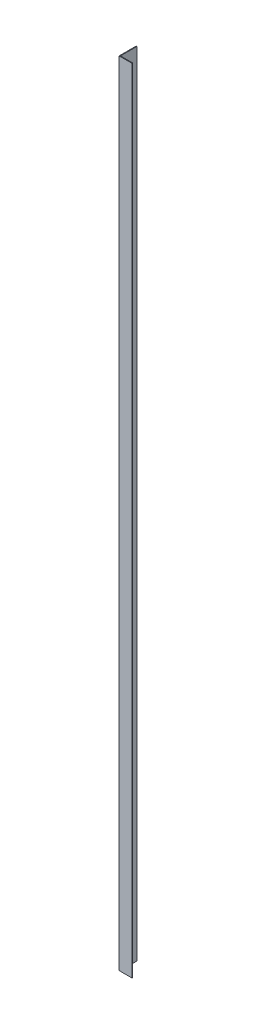
ISO-10303-21;
HEADER;
FILE_DESCRIPTION(('STEP AP214'),'2;1');
FILE_NAME('part.step','',(''),(''),'','','');
FILE_SCHEMA(('AUTOMOTIVE_DESIGN { 1 0 10303 214 1 1 1 1 }'));
ENDSEC;
DATA;
#1=APPLICATION_CONTEXT('core data for automotive mechanical design processes');
#2=APPLICATION_PROTOCOL_DEFINITION('international standard','automotive_design',2000,#1);
#3=PRODUCT_CONTEXT('',#1,'mechanical');
#4=PRODUCT('Part','Part','',(#3));
#5=PRODUCT_RELATED_PRODUCT_CATEGORY('part','',(#4));
#6=PRODUCT_DEFINITION_FORMATION('','',#4);
#7=PRODUCT_DEFINITION_CONTEXT('part definition',#1,'design');
#8=PRODUCT_DEFINITION('design','',#6,#7);
#9=PRODUCT_DEFINITION_SHAPE('','',#8);
#10=(LENGTH_UNIT() NAMED_UNIT(*) SI_UNIT(.MILLI.,.METRE.));
#11=(NAMED_UNIT(*) PLANE_ANGLE_UNIT() SI_UNIT($,.RADIAN.));
#12=(NAMED_UNIT(*) SI_UNIT($,.STERADIAN.) SOLID_ANGLE_UNIT());
#13=UNCERTAINTY_MEASURE_WITH_UNIT(LENGTH_MEASURE(1.E-05),#10,'distance_accuracy_value','');
#14=(GEOMETRIC_REPRESENTATION_CONTEXT(3) GLOBAL_UNCERTAINTY_ASSIGNED_CONTEXT((#13)) GLOBAL_UNIT_ASSIGNED_CONTEXT((#10,
#11,#12)) REPRESENTATION_CONTEXT('',''));
#15=CARTESIAN_POINT('',(0.,0.,0.));
#16=DIRECTION('',(0.,0.,1.));
#17=DIRECTION('',(1.,0.,0.));
#18=AXIS2_PLACEMENT_3D('',#15,#16,#17);
#19=CARTESIAN_POINT('',(670.,1970.,40.));
#20=DIRECTION('',(0.,0.,-1.));
#21=DIRECTION('',(-1.,0.,0.));
#22=AXIS2_PLACEMENT_3D('',#19,#20,#21);
#23=PLANE('',#22);
#24=DIRECTION('',(1.,0.,0.));
#25=VECTOR('',#24,1.);
#26=CARTESIAN_POINT('',(670.,120.,40.));
#27=LINE('',#26,#25);
#28=CARTESIAN_POINT('',(670.,120.,40.));
#29=VERTEX_POINT('',#28);
#30=CARTESIAN_POINT('',(700.,120.,40.));
#31=VERTEX_POINT('',#30);
#32=EDGE_CURVE('E123',#29,#31,#27,.T.);
#33=ORIENTED_EDGE('',*,*,#32,.T.);
#34=DIRECTION('',(0.,-1.,0.));
#35=VECTOR('',#34,1.);
#36=CARTESIAN_POINT('',(700.,1970.,40.));
#37=LINE('',#36,#35);
#38=CARTESIAN_POINT('',(700.,1970.,40.));
#39=VERTEX_POINT('',#38);
#40=EDGE_CURVE('E11',#39,#31,#37,.T.);
#41=ORIENTED_EDGE('',*,*,#40,.F.);
#42=DIRECTION('',(1.,0.,0.));
#43=VECTOR('',#42,1.);
#44=CARTESIAN_POINT('',(670.,1970.,40.));
#45=LINE('',#44,#43);
#46=CARTESIAN_POINT('',(670.,1970.,40.));
#47=VERTEX_POINT('',#46);
#48=EDGE_CURVE('E133',#47,#39,#45,.T.);
#49=ORIENTED_EDGE('',*,*,#48,.F.);
#50=DIRECTION('',(0.,-1.,0.));
#51=VECTOR('',#50,1.);
#52=CARTESIAN_POINT('',(670.,1970.,40.));
#53=LINE('',#52,#51);
#54=EDGE_CURVE('E119',#47,#29,#53,.T.);
#55=ORIENTED_EDGE('',*,*,#54,.T.);
#56=EDGE_LOOP('',(#33,#41,#49,#55));
#57=FACE_BOUND('',#56,.T.);
#58=ADVANCED_FACE('F39',(#57),#23,.F.);
#59=CARTESIAN_POINT('',(700.,1970.,40.));
#60=DIRECTION('',(-1.,0.,0.));
#61=DIRECTION('',(0.,0.,1.));
#62=AXIS2_PLACEMENT_3D('',#59,#60,#61);
#63=PLANE('',#62);
#64=DIRECTION('',(0.,0.,-1.));
#65=VECTOR('',#64,1.);
#66=CARTESIAN_POINT('',(700.,120.,40.));
#67=LINE('',#66,#65);
#68=CARTESIAN_POINT('',(700.,120.,38.5));
#69=VERTEX_POINT('',#68);
#70=EDGE_CURVE('E126',#31,#69,#67,.T.);
#71=ORIENTED_EDGE('',*,*,#70,.T.);
#72=DIRECTION('',(0.,-1.,0.));
#73=VECTOR('',#72,1.);
#74=CARTESIAN_POINT('',(700.,1970.,38.5));
#75=LINE('',#74,#73);
#76=CARTESIAN_POINT('',(700.,1970.,38.5));
#77=VERTEX_POINT('',#76);
#78=EDGE_CURVE('E47',#77,#69,#75,.T.);
#79=ORIENTED_EDGE('',*,*,#78,.F.);
#80=DIRECTION('',(0.,0.,-1.));
#81=VECTOR('',#80,1.);
#82=CARTESIAN_POINT('',(700.,1970.,40.));
#83=LINE('',#82,#81);
#84=EDGE_CURVE('E92',#39,#77,#83,.T.);
#85=ORIENTED_EDGE('',*,*,#84,.F.);
#86=ORIENTED_EDGE('',*,*,#40,.T.);
#87=EDGE_LOOP('',(#71,#79,#85,#86));
#88=FACE_BOUND('',#87,.T.);
#89=ADVANCED_FACE('F157',(#88),#63,.F.);
#90=CARTESIAN_POINT('',(700.,1970.,38.5));
#91=DIRECTION('',(0.,0.,1.));
#92=DIRECTION('',(1.,0.,0.));
#93=AXIS2_PLACEMENT_3D('',#90,#91,#92);
#94=PLANE('',#93);
#95=DIRECTION('',(-1.,0.,0.));
#96=VECTOR('',#95,1.);
#97=CARTESIAN_POINT('',(700.,120.,38.5));
#98=LINE('',#97,#96);
#99=CARTESIAN_POINT('',(671.5,120.,38.5));
#100=VERTEX_POINT('',#99);
#101=EDGE_CURVE('E128',#69,#100,#98,.T.);
#102=ORIENTED_EDGE('',*,*,#101,.T.);
#103=DIRECTION('',(0.,-1.,0.));
#104=VECTOR('',#103,1.);
#105=CARTESIAN_POINT('',(671.5,1970.,38.5));
#106=LINE('',#105,#104);
#107=CARTESIAN_POINT('',(671.5,1970.,38.5));
#108=VERTEX_POINT('',#107);
#109=EDGE_CURVE('E114',#108,#100,#106,.T.);
#110=ORIENTED_EDGE('',*,*,#109,.F.);
#111=DIRECTION('',(-1.,0.,0.));
#112=VECTOR('',#111,1.);
#113=CARTESIAN_POINT('',(700.,1970.,38.5));
#114=LINE('',#113,#112);
#115=EDGE_CURVE('E105',#77,#108,#114,.T.);
#116=ORIENTED_EDGE('',*,*,#115,.F.);
#117=ORIENTED_EDGE('',*,*,#78,.T.);
#118=EDGE_LOOP('',(#102,#110,#116,#117));
#119=FACE_BOUND('',#118,.T.);
#120=ADVANCED_FACE('F139',(#119),#94,.F.);
#121=CARTESIAN_POINT('',(671.5,1970.,38.5));
#122=DIRECTION('',(-1.,0.,0.));
#123=DIRECTION('',(0.,0.,1.));
#124=AXIS2_PLACEMENT_3D('',#121,#122,#123);
#125=PLANE('',#124);
#126=DIRECTION('',(0.,0.,-1.));
#127=VECTOR('',#126,1.);
#128=CARTESIAN_POINT('',(671.5,120.,38.5));
#129=LINE('',#128,#127);
#130=CARTESIAN_POINT('',(671.5,120.,0.));
#131=VERTEX_POINT('',#130);
#132=EDGE_CURVE('E113',#100,#131,#129,.T.);
#133=ORIENTED_EDGE('',*,*,#132,.T.);
#134=DIRECTION('',(0.,-1.,0.));
#135=VECTOR('',#134,1.);
#136=CARTESIAN_POINT('',(671.5,1970.,0.));
#137=LINE('',#136,#135);
#138=CARTESIAN_POINT('',(671.5,1970.,0.));
#139=VERTEX_POINT('',#138);
#140=EDGE_CURVE('E110',#139,#131,#137,.T.);
#141=ORIENTED_EDGE('',*,*,#140,.F.);
#142=DIRECTION('',(0.,0.,-1.));
#143=VECTOR('',#142,1.);
#144=CARTESIAN_POINT('',(671.5,1970.,38.5));
#145=LINE('',#144,#143);
#146=EDGE_CURVE('E99',#108,#139,#145,.T.);
#147=ORIENTED_EDGE('',*,*,#146,.F.);
#148=ORIENTED_EDGE('',*,*,#109,.T.);
#149=EDGE_LOOP('',(#133,#141,#147,#148));
#150=FACE_BOUND('',#149,.T.);
#151=ADVANCED_FACE('F111',(#150),#125,.F.);
#152=CARTESIAN_POINT('',(671.5,1970.,0.));
#153=DIRECTION('',(0.,0.,1.));
#154=DIRECTION('',(1.,0.,0.));
#155=AXIS2_PLACEMENT_3D('',#152,#153,#154);
#156=PLANE('',#155);
#157=DIRECTION('',(-1.,0.,0.));
#158=VECTOR('',#157,1.);
#159=CARTESIAN_POINT('',(671.5,120.,0.));
#160=LINE('',#159,#158);
#161=CARTESIAN_POINT('',(670.,120.,0.));
#162=VERTEX_POINT('',#161);
#163=EDGE_CURVE('E78',#131,#162,#160,.T.);
#164=ORIENTED_EDGE('',*,*,#163,.T.);
#165=DIRECTION('',(0.,-1.,0.));
#166=VECTOR('',#165,1.);
#167=CARTESIAN_POINT('',(670.,1970.,0.));
#168=LINE('',#167,#166);
#169=CARTESIAN_POINT('',(670.,1970.,0.));
#170=VERTEX_POINT('',#169);
#171=EDGE_CURVE('E115',#170,#162,#168,.T.);
#172=ORIENTED_EDGE('',*,*,#171,.F.);
#173=DIRECTION('',(-1.,0.,0.));
#174=VECTOR('',#173,1.);
#175=CARTESIAN_POINT('',(671.5,1970.,0.));
#176=LINE('',#175,#174);
#177=EDGE_CURVE('E103',#139,#170,#176,.T.);
#178=ORIENTED_EDGE('',*,*,#177,.F.);
#179=ORIENTED_EDGE('',*,*,#140,.T.);
#180=EDGE_LOOP('',(#164,#172,#178,#179));
#181=FACE_BOUND('',#180,.T.);
#182=ADVANCED_FACE('F117',(#181),#156,.F.);
#183=CARTESIAN_POINT('',(670.,1970.,0.));
#184=DIRECTION('',(1.,0.,0.));
#185=DIRECTION('',(0.,0.,-1.));
#186=AXIS2_PLACEMENT_3D('',#183,#184,#185);
#187=PLANE('',#186);
#188=DIRECTION('',(0.,0.,1.));
#189=VECTOR('',#188,1.);
#190=CARTESIAN_POINT('',(670.,120.,0.));
#191=LINE('',#190,#189);
#192=EDGE_CURVE('E84',#162,#29,#191,.T.);
#193=ORIENTED_EDGE('',*,*,#192,.T.);
#194=ORIENTED_EDGE('',*,*,#54,.F.);
#195=DIRECTION('',(0.,0.,1.));
#196=VECTOR('',#195,1.);
#197=CARTESIAN_POINT('',(670.,1970.,0.));
#198=LINE('',#197,#196);
#199=EDGE_CURVE('E55',#170,#47,#198,.T.);
#200=ORIENTED_EDGE('',*,*,#199,.F.);
#201=ORIENTED_EDGE('',*,*,#171,.T.);
#202=EDGE_LOOP('',(#193,#194,#200,#201));
#203=FACE_BOUND('',#202,.T.);
#204=ADVANCED_FACE('F146',(#203),#187,.F.);
#205=CARTESIAN_POINT('',(0.,1970.,0.));
#206=DIRECTION('',(0.,1.,0.));
#207=DIRECTION('',(0.,0.,1.));
#208=AXIS2_PLACEMENT_3D('',#205,#206,#207);
#209=PLANE('',#208);
#210=ORIENTED_EDGE('',*,*,#48,.T.);
#211=ORIENTED_EDGE('',*,*,#84,.T.);
#212=ORIENTED_EDGE('',*,*,#115,.T.);
#213=ORIENTED_EDGE('',*,*,#146,.T.);
#214=ORIENTED_EDGE('',*,*,#177,.T.);
#215=ORIENTED_EDGE('',*,*,#199,.T.);
#216=EDGE_LOOP('',(#210,#211,#212,#213,#214,#215));
#217=FACE_BOUND('',#216,.T.);
#218=ADVANCED_FACE('F101',(#217),#209,.T.);
#219=CARTESIAN_POINT('',(0.,120.,0.));
#220=DIRECTION('',(0.,1.,0.));
#221=DIRECTION('',(0.,0.,1.));
#222=AXIS2_PLACEMENT_3D('',#219,#220,#221);
#223=PLANE('',#222);
#224=ORIENTED_EDGE('',*,*,#32,.F.);
#225=ORIENTED_EDGE('',*,*,#192,.F.);
#226=ORIENTED_EDGE('',*,*,#163,.F.);
#227=ORIENTED_EDGE('',*,*,#132,.F.);
#228=ORIENTED_EDGE('',*,*,#101,.F.);
#229=ORIENTED_EDGE('',*,*,#70,.F.);
#230=EDGE_LOOP('',(#224,#225,#226,#227,#228,#229));
#231=FACE_BOUND('',#230,.T.);
#232=ADVANCED_FACE('F142',(#231),#223,.F.);
#233=CLOSED_SHELL('',(#58,#89,#120,#151,#182,#204,#218,#232));
#234=MANIFOLD_SOLID_BREP('B2',#233);
#235=ADVANCED_BREP_SHAPE_REPRESENTATION('',(#18,#234),#14);
#236=SHAPE_DEFINITION_REPRESENTATION(#9,#235);
ENDSEC;
END-ISO-10303-21;
